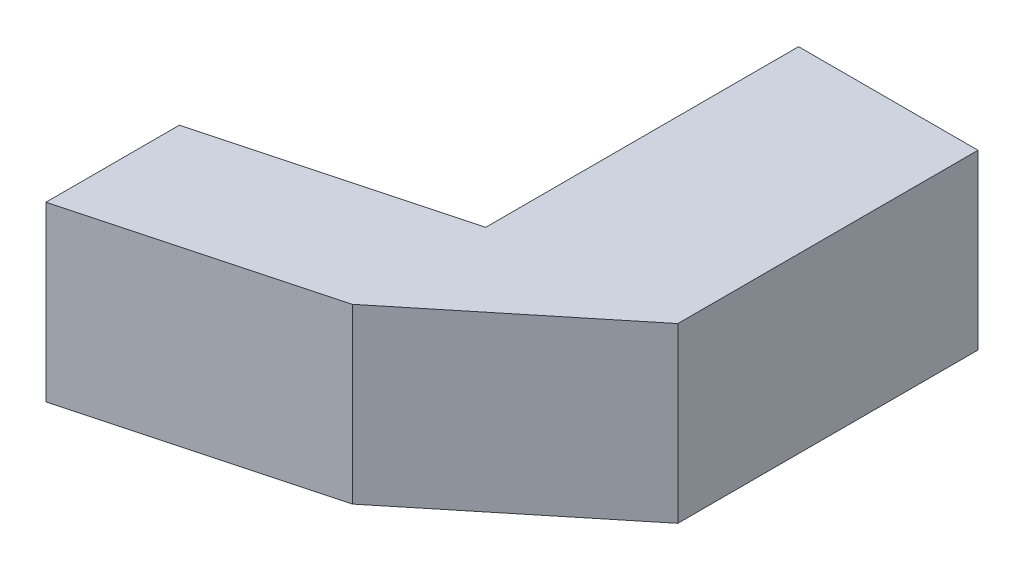
ISO-10303-21;
HEADER;
FILE_DESCRIPTION(('STEP AP214'),'2;1');
FILE_NAME('part.step','',(''),(''),'','','');
FILE_SCHEMA(('AUTOMOTIVE_DESIGN { 1 0 10303 214 1 1 1 1 }'));
ENDSEC;
DATA;
#1=APPLICATION_CONTEXT('core data for automotive mechanical design processes');
#2=APPLICATION_PROTOCOL_DEFINITION('international standard','automotive_design',2000,#1);
#3=PRODUCT_CONTEXT('',#1,'mechanical');
#4=PRODUCT('Part','Part','',(#3));
#5=PRODUCT_RELATED_PRODUCT_CATEGORY('part','',(#4));
#6=PRODUCT_DEFINITION_FORMATION('','',#4);
#7=PRODUCT_DEFINITION_CONTEXT('part definition',#1,'design');
#8=PRODUCT_DEFINITION('design','',#6,#7);
#9=PRODUCT_DEFINITION_SHAPE('','',#8);
#10=(LENGTH_UNIT() NAMED_UNIT(*) SI_UNIT(.MILLI.,.METRE.));
#11=(NAMED_UNIT(*) PLANE_ANGLE_UNIT() SI_UNIT($,.RADIAN.));
#12=(NAMED_UNIT(*) SI_UNIT($,.STERADIAN.) SOLID_ANGLE_UNIT());
#13=UNCERTAINTY_MEASURE_WITH_UNIT(LENGTH_MEASURE(1.E-05),#10,'distance_accuracy_value','');
#14=(GEOMETRIC_REPRESENTATION_CONTEXT(3) GLOBAL_UNCERTAINTY_ASSIGNED_CONTEXT((#13)) GLOBAL_UNIT_ASSIGNED_CONTEXT((#10,
#11,#12)) REPRESENTATION_CONTEXT('',''));
#15=CARTESIAN_POINT('',(0.,0.,0.));
#16=DIRECTION('',(0.,0.,1.));
#17=DIRECTION('',(1.,0.,0.));
#18=AXIS2_PLACEMENT_3D('',#15,#16,#17);
#19=CARTESIAN_POINT('',(-3.379468,-3.1875,18.));
#20=DIRECTION('',(0.,1.,0.));
#21=DIRECTION('',(0.,0.,1.));
#22=AXIS2_PLACEMENT_3D('',#19,#20,#21);
#23=PLANE('',#22);
#24=DIRECTION('',(0.,0.,-1.));
#25=VECTOR('',#24,1.);
#26=CARTESIAN_POINT('',(-3.379468,-3.1875,18.));
#27=LINE('',#26,#25);
#28=CARTESIAN_POINT('',(-3.379468,-3.1875,24.758936));
#29=VERTEX_POINT('',#28);
#30=CARTESIAN_POINT('',(-3.379468,-3.1875,0.));
#31=VERTEX_POINT('',#30);
#32=EDGE_CURVE('E211',#29,#31,#27,.T.);
#33=ORIENTED_EDGE('',*,*,#32,.F.);
#34=DIRECTION('',(0.707106781186546,0.,-0.707106781186549));
#35=VECTOR('',#34,1.);
#36=CARTESIAN_POINT('',(3.379468,-3.1875,18.));
#37=LINE('',#36,#35);
#38=CARTESIAN_POINT('',(3.379468,-3.1875,18.));
#39=VERTEX_POINT('',#38);
#40=EDGE_CURVE('E224',#29,#39,#37,.T.);
#41=ORIENTED_EDGE('',*,*,#40,.T.);
#42=DIRECTION('',(0.,0.,-1.));
#43=VECTOR('',#42,1.);
#44=CARTESIAN_POINT('',(3.379468,-3.1875,18.));
#45=LINE('',#44,#43);
#46=CARTESIAN_POINT('',(3.379468,-3.1875,0.));
#47=VERTEX_POINT('',#46);
#48=EDGE_CURVE('E208',#39,#47,#45,.T.);
#49=ORIENTED_EDGE('',*,*,#48,.T.);
#50=DIRECTION('',(1.,0.,0.));
#51=VECTOR('',#50,1.);
#52=CARTESIAN_POINT('',(-3.379468,-3.1875,0.));
#53=LINE('',#52,#51);
#54=EDGE_CURVE('E217',#31,#47,#53,.T.);
#55=ORIENTED_EDGE('',*,*,#54,.F.);
#56=EDGE_LOOP('',(#33,#41,#49,#55));
#57=FACE_BOUND('',#56,.T.);
#58=ADVANCED_FACE('F85',(#57),#23,.T.);
#59=CARTESIAN_POINT('',(-5.379468,-5.1875,18.));
#60=DIRECTION('',(0.,1.,0.));
#61=DIRECTION('',(0.,0.,1.));
#62=AXIS2_PLACEMENT_3D('',#59,#60,#61);
#63=PLANE('',#62);
#64=DIRECTION('',(0.,0.,-1.));
#65=VECTOR('',#64,1.);
#66=CARTESIAN_POINT('',(5.379468,-5.1875,18.));
#67=LINE('',#66,#65);
#68=CARTESIAN_POINT('',(5.379468,-5.1875,18.));
#69=VERTEX_POINT('',#68);
#70=CARTESIAN_POINT('',(5.379468,-5.1875,0.));
#71=VERTEX_POINT('',#70);
#72=EDGE_CURVE('E12',#69,#71,#67,.T.);
#73=ORIENTED_EDGE('',*,*,#72,.F.);
#74=DIRECTION('',(-0.775503330958341,0.,0.631343475195964));
#75=VECTOR('',#74,1.);
#76=CARTESIAN_POINT('',(-5.379468,-5.1875,26.758936));
#77=LINE('',#76,#75);
#78=CARTESIAN_POINT('',(-5.379468,-5.1875,26.758936));
#79=VERTEX_POINT('',#78);
#80=EDGE_CURVE('E179',#69,#79,#77,.T.);
#81=ORIENTED_EDGE('',*,*,#80,.T.);
#82=DIRECTION('',(-0.965925826289069,0.,0.258819045102518));
#83=VECTOR('',#82,1.);
#84=CARTESIAN_POINT('',(-5.379468,-5.1875,26.758936));
#85=LINE('',#84,#83);
#86=CARTESIAN_POINT('',(-19.868355394336,-5.1875,30.6412216765378));
#87=VERTEX_POINT('',#86);
#88=EDGE_CURVE('E178',#79,#87,#85,.T.);
#89=ORIENTED_EDGE('',*,*,#88,.T.);
#90=DIRECTION('',(0.,0.,-1.));
#91=VECTOR('',#90,1.);
#92=CARTESIAN_POINT('',(-19.868355394336,-5.1875,30.6412216765378));
#93=LINE('',#92,#91);
#94=CARTESIAN_POINT('',(-19.868355394336,-5.1875,22.6412216765378));
#95=VERTEX_POINT('',#94);
#96=EDGE_CURVE('E250',#87,#95,#93,.T.);
#97=ORIENTED_EDGE('',*,*,#96,.T.);
#98=DIRECTION('',(0.965925826289069,0.,-0.258819045102518));
#99=VECTOR('',#98,1.);
#100=CARTESIAN_POINT('',(-19.868355394336,-5.1875,22.6412216765378));
#101=LINE('',#100,#99);
#102=CARTESIAN_POINT('',(-5.379468,-5.1875,18.758936));
#103=VERTEX_POINT('',#102);
#104=EDGE_CURVE('E247',#95,#103,#101,.T.);
#105=ORIENTED_EDGE('',*,*,#104,.T.);
#106=DIRECTION('',(0.,0.,-1.));
#107=VECTOR('',#106,1.);
#108=CARTESIAN_POINT('',(-5.379468,-5.1875,18.));
#109=LINE('',#108,#107);
#110=CARTESIAN_POINT('',(-5.379468,-5.1875,0.));
#111=VERTEX_POINT('',#110);
#112=EDGE_CURVE('E187',#103,#111,#109,.T.);
#113=ORIENTED_EDGE('',*,*,#112,.T.);
#114=DIRECTION('',(1.,0.,0.));
#115=VECTOR('',#114,1.);
#116=CARTESIAN_POINT('',(-5.379468,-5.1875,0.));
#117=LINE('',#116,#115);
#118=EDGE_CURVE('E202',#111,#71,#117,.T.);
#119=ORIENTED_EDGE('',*,*,#118,.T.);
#120=EDGE_LOOP('',(#73,#81,#89,#97,#105,#113,#119));
#121=FACE_BOUND('',#120,.T.);
#122=ADVANCED_FACE('F87',(#121),#63,.F.);
#123=CARTESIAN_POINT('',(5.379468,-5.1875,18.));
#124=DIRECTION('',(-1.,0.,0.));
#125=DIRECTION('',(0.,0.,1.));
#126=AXIS2_PLACEMENT_3D('',#123,#124,#125);
#127=PLANE('',#126);
#128=DIRECTION('',(0.,1.,0.));
#129=VECTOR('',#128,1.);
#130=CARTESIAN_POINT('',(5.379468,-5.1875,0.));
#131=LINE('',#130,#129);
#132=CARTESIAN_POINT('',(5.379468,5.1875,0.));
#133=VERTEX_POINT('',#132);
#134=EDGE_CURVE('E191',#71,#133,#131,.T.);
#135=ORIENTED_EDGE('',*,*,#134,.T.);
#136=DIRECTION('',(0.,0.,-1.));
#137=VECTOR('',#136,1.);
#138=CARTESIAN_POINT('',(5.379468,5.1875,18.));
#139=LINE('',#138,#137);
#140=CARTESIAN_POINT('',(5.379468,5.1875,18.));
#141=VERTEX_POINT('',#140);
#142=EDGE_CURVE('E93',#141,#133,#139,.T.);
#143=ORIENTED_EDGE('',*,*,#142,.F.);
#144=DIRECTION('',(0.,1.,0.));
#145=VECTOR('',#144,1.);
#146=CARTESIAN_POINT('',(5.379468,-5.1875,18.));
#147=LINE('',#146,#145);
#148=EDGE_CURVE('E182',#69,#141,#147,.T.);
#149=ORIENTED_EDGE('',*,*,#148,.F.);
#150=ORIENTED_EDGE('',*,*,#72,.T.);
#151=EDGE_LOOP('',(#135,#143,#149,#150));
#152=FACE_BOUND('',#151,.T.);
#153=ADVANCED_FACE('F190',(#152),#127,.F.);
#154=CARTESIAN_POINT('',(-5.379468,5.1875,18.));
#155=DIRECTION('',(0.,1.,0.));
#156=DIRECTION('',(0.,0.,1.));
#157=AXIS2_PLACEMENT_3D('',#154,#155,#156);
#158=PLANE('',#157);
#159=DIRECTION('',(-0.775503330958341,0.,0.631343475195964));
#160=VECTOR('',#159,1.);
#161=CARTESIAN_POINT('',(-5.379468,5.1875,26.758936));
#162=LINE('',#161,#160);
#163=CARTESIAN_POINT('',(-5.379468,5.1875,26.758936));
#164=VERTEX_POINT('',#163);
#165=EDGE_CURVE('E168',#141,#164,#162,.T.);
#166=ORIENTED_EDGE('',*,*,#165,.F.);
#167=ORIENTED_EDGE('',*,*,#142,.T.);
#168=DIRECTION('',(1.,0.,0.));
#169=VECTOR('',#168,1.);
#170=CARTESIAN_POINT('',(-5.379468,5.1875,0.));
#171=LINE('',#170,#169);
#172=CARTESIAN_POINT('',(-5.379468,5.1875,0.));
#173=VERTEX_POINT('',#172);
#174=EDGE_CURVE('E199',#173,#133,#171,.T.);
#175=ORIENTED_EDGE('',*,*,#174,.F.);
#176=DIRECTION('',(0.,0.,-1.));
#177=VECTOR('',#176,1.);
#178=CARTESIAN_POINT('',(-5.379468,5.1875,18.));
#179=LINE('',#178,#177);
#180=CARTESIAN_POINT('',(-5.379468,5.1875,18.758936));
#181=VERTEX_POINT('',#180);
#182=EDGE_CURVE('E193',#181,#173,#179,.T.);
#183=ORIENTED_EDGE('',*,*,#182,.F.);
#184=DIRECTION('',(0.965925826289069,0.,-0.258819045102518));
#185=VECTOR('',#184,1.);
#186=CARTESIAN_POINT('',(-19.868355394336,5.1875,22.6412216765378));
#187=LINE('',#186,#185);
#188=CARTESIAN_POINT('',(-19.868355394336,5.1875,22.6412216765378));
#189=VERTEX_POINT('',#188);
#190=EDGE_CURVE('E240',#189,#181,#187,.T.);
#191=ORIENTED_EDGE('',*,*,#190,.F.);
#192=DIRECTION('',(0.,0.,-1.));
#193=VECTOR('',#192,1.);
#194=CARTESIAN_POINT('',(-19.868355394336,5.1875,30.6412216765378));
#195=LINE('',#194,#193);
#196=CARTESIAN_POINT('',(-19.868355394336,5.1875,30.6412216765378));
#197=VERTEX_POINT('',#196);
#198=EDGE_CURVE('E237',#197,#189,#195,.T.);
#199=ORIENTED_EDGE('',*,*,#198,.F.);
#200=DIRECTION('',(-0.965925826289069,0.,0.258819045102518));
#201=VECTOR('',#200,1.);
#202=CARTESIAN_POINT('',(-5.379468,5.1875,26.758936));
#203=LINE('',#202,#201);
#204=EDGE_CURVE('E175',#164,#197,#203,.T.);
#205=ORIENTED_EDGE('',*,*,#204,.F.);
#206=EDGE_LOOP('',(#166,#167,#175,#183,#191,#199,#205));
#207=FACE_BOUND('',#206,.T.);
#208=ADVANCED_FACE('F170',(#207),#158,.T.);
#209=CARTESIAN_POINT('',(-5.379468,-5.1875,18.));
#210=DIRECTION('',(-1.,0.,0.));
#211=DIRECTION('',(0.,0.,1.));
#212=AXIS2_PLACEMENT_3D('',#209,#210,#211);
#213=PLANE('',#212);
#214=DIRECTION('',(0.,-1.,0.));
#215=VECTOR('',#214,1.);
#216=CARTESIAN_POINT('',(-5.379468,23.9256047820905,18.758936));
#217=LINE('',#216,#215);
#218=EDGE_CURVE('E100',#181,#103,#217,.T.);
#219=ORIENTED_EDGE('',*,*,#218,.F.);
#220=ORIENTED_EDGE('',*,*,#182,.T.);
#221=DIRECTION('',(0.,1.,0.));
#222=VECTOR('',#221,1.);
#223=CARTESIAN_POINT('',(-5.379468,-5.1875,0.));
#224=LINE('',#223,#222);
#225=EDGE_CURVE('E188',#111,#173,#224,.T.);
#226=ORIENTED_EDGE('',*,*,#225,.F.);
#227=ORIENTED_EDGE('',*,*,#112,.F.);
#228=EDGE_LOOP('',(#219,#220,#226,#227));
#229=FACE_BOUND('',#228,.T.);
#230=ADVANCED_FACE('F268',(#229),#213,.T.);
#231=CARTESIAN_POINT('',(0.,0.,0.));
#232=DIRECTION('',(0.,0.,1.));
#233=DIRECTION('',(1.,0.,0.));
#234=AXIS2_PLACEMENT_3D('',#231,#232,#233);
#235=PLANE('',#234);
#236=DIRECTION('',(0.,1.,0.));
#237=VECTOR('',#236,1.);
#238=CARTESIAN_POINT('',(3.379468,-3.1875,0.));
#239=LINE('',#238,#237);
#240=CARTESIAN_POINT('',(3.379468,3.1875,0.));
#241=VERTEX_POINT('',#240);
#242=EDGE_CURVE('E220',#47,#241,#239,.T.);
#243=ORIENTED_EDGE('',*,*,#242,.T.);
#244=DIRECTION('',(1.,0.,0.));
#245=VECTOR('',#244,1.);
#246=CARTESIAN_POINT('',(-3.379468,3.1875,0.));
#247=LINE('',#246,#245);
#248=CARTESIAN_POINT('',(-3.379468,3.1875,0.));
#249=VERTEX_POINT('',#248);
#250=EDGE_CURVE('E108',#249,#241,#247,.T.);
#251=ORIENTED_EDGE('',*,*,#250,.F.);
#252=DIRECTION('',(0.,1.,0.));
#253=VECTOR('',#252,1.);
#254=CARTESIAN_POINT('',(-3.379468,-3.1875,0.));
#255=LINE('',#254,#253);
#256=EDGE_CURVE('E214',#31,#249,#255,.T.);
#257=ORIENTED_EDGE('',*,*,#256,.F.);
#258=ORIENTED_EDGE('',*,*,#54,.T.);
#259=EDGE_LOOP('',(#243,#251,#257,#258));
#260=FACE_BOUND('',#259,.T.);
#261=ORIENTED_EDGE('',*,*,#118,.F.);
#262=ORIENTED_EDGE('',*,*,#225,.T.);
#263=ORIENTED_EDGE('',*,*,#174,.T.);
#264=ORIENTED_EDGE('',*,*,#134,.F.);
#265=EDGE_LOOP('',(#261,#262,#263,#264));
#266=FACE_BOUND('',#265,.T.);
#267=ADVANCED_FACE('F271',(#260,#266),#235,.F.);
#268=CARTESIAN_POINT('',(-3.379468,3.1875,18.));
#269=DIRECTION('',(0.,1.,0.));
#270=DIRECTION('',(0.,0.,1.));
#271=AXIS2_PLACEMENT_3D('',#268,#269,#270);
#272=PLANE('',#271);
#273=ORIENTED_EDGE('',*,*,#250,.T.);
#274=DIRECTION('',(0.,0.,-1.));
#275=VECTOR('',#274,1.);
#276=CARTESIAN_POINT('',(3.379468,3.1875,18.));
#277=LINE('',#276,#275);
#278=CARTESIAN_POINT('',(3.379468,3.1875,18.));
#279=VERTEX_POINT('',#278);
#280=EDGE_CURVE('E206',#279,#241,#277,.T.);
#281=ORIENTED_EDGE('',*,*,#280,.F.);
#282=DIRECTION('',(0.707106781186546,0.,-0.707106781186549));
#283=VECTOR('',#282,1.);
#284=CARTESIAN_POINT('',(-10.7106936018909,3.1875,32.0901616018909));
#285=LINE('',#284,#283);
#286=CARTESIAN_POINT('',(-3.379468,3.1875,24.758936));
#287=VERTEX_POINT('',#286);
#288=EDGE_CURVE('E231',#287,#279,#285,.T.);
#289=ORIENTED_EDGE('',*,*,#288,.F.);
#290=DIRECTION('',(0.,0.,-1.));
#291=VECTOR('',#290,1.);
#292=CARTESIAN_POINT('',(-3.379468,3.1875,18.));
#293=LINE('',#292,#291);
#294=EDGE_CURVE('E204',#287,#249,#293,.T.);
#295=ORIENTED_EDGE('',*,*,#294,.T.);
#296=EDGE_LOOP('',(#273,#281,#289,#295));
#297=FACE_BOUND('',#296,.T.);
#298=ADVANCED_FACE('F273',(#297),#272,.F.);
#299=CARTESIAN_POINT('',(-3.379468,-3.1875,18.));
#300=DIRECTION('',(-1.,0.,0.));
#301=DIRECTION('',(0.,0.,1.));
#302=AXIS2_PLACEMENT_3D('',#299,#300,#301);
#303=PLANE('',#302);
#304=ORIENTED_EDGE('',*,*,#256,.T.);
#305=ORIENTED_EDGE('',*,*,#294,.F.);
#306=DIRECTION('',(0.,1.,0.));
#307=VECTOR('',#306,1.);
#308=CARTESIAN_POINT('',(-3.379468,-3.1875,24.758936));
#309=LINE('',#308,#307);
#310=EDGE_CURVE('E233',#29,#287,#309,.T.);
#311=ORIENTED_EDGE('',*,*,#310,.F.);
#312=ORIENTED_EDGE('',*,*,#32,.T.);
#313=EDGE_LOOP('',(#304,#305,#311,#312));
#314=FACE_BOUND('',#313,.T.);
#315=ADVANCED_FACE('F280',(#314),#303,.F.);
#316=CARTESIAN_POINT('',(3.379468,-3.1875,18.));
#317=DIRECTION('',(-1.,0.,0.));
#318=DIRECTION('',(0.,0.,1.));
#319=AXIS2_PLACEMENT_3D('',#316,#317,#318);
#320=PLANE('',#319);
#321=ORIENTED_EDGE('',*,*,#242,.F.);
#322=ORIENTED_EDGE('',*,*,#48,.F.);
#323=DIRECTION('',(0.,1.,0.));
#324=VECTOR('',#323,1.);
#325=CARTESIAN_POINT('',(3.379468,-3.1875,18.));
#326=LINE('',#325,#324);
#327=EDGE_CURVE('E209',#39,#279,#326,.T.);
#328=ORIENTED_EDGE('',*,*,#327,.T.);
#329=ORIENTED_EDGE('',*,*,#280,.T.);
#330=EDGE_LOOP('',(#321,#322,#328,#329));
#331=FACE_BOUND('',#330,.T.);
#332=ADVANCED_FACE('F293',(#331),#320,.T.);
#333=CARTESIAN_POINT('',(-5.379468,23.9256047820905,26.758936));
#334=DIRECTION('',(0.258819045102518,0.,0.965925826289069));
#335=DIRECTION('',(0.965925826289069,0.,-0.258819045102518));
#336=AXIS2_PLACEMENT_3D('',#333,#334,#335);
#337=PLANE('',#336);
#338=DIRECTION('',(0.,1.,0.));
#339=VECTOR('',#338,1.);
#340=CARTESIAN_POINT('',(-5.379468,-5.1875,26.758936));
#341=LINE('',#340,#339);
#342=EDGE_CURVE('E229',#79,#164,#341,.T.);
#343=ORIENTED_EDGE('',*,*,#342,.T.);
#344=ORIENTED_EDGE('',*,*,#204,.T.);
#345=DIRECTION('',(0.,-1.,0.));
#346=VECTOR('',#345,1.);
#347=CARTESIAN_POINT('',(-19.868355394336,23.9256047820905,30.6412216765378));
#348=LINE('',#347,#346);
#349=EDGE_CURVE('E235',#197,#87,#348,.T.);
#350=ORIENTED_EDGE('',*,*,#349,.T.);
#351=ORIENTED_EDGE('',*,*,#88,.F.);
#352=EDGE_LOOP('',(#343,#344,#350,#351));
#353=FACE_BOUND('',#352,.T.);
#354=ADVANCED_FACE('F258',(#353),#337,.T.);
#355=CARTESIAN_POINT('',(-19.868355394336,23.9256047820905,30.6412216765378));
#356=DIRECTION('',(-1.,0.,0.));
#357=DIRECTION('',(0.,0.,1.));
#358=AXIS2_PLACEMENT_3D('',#355,#356,#357);
#359=PLANE('',#358);
#360=ORIENTED_EDGE('',*,*,#349,.F.);
#361=ORIENTED_EDGE('',*,*,#198,.T.);
#362=DIRECTION('',(0.,-1.,0.));
#363=VECTOR('',#362,1.);
#364=CARTESIAN_POINT('',(-19.868355394336,23.9256047820905,22.6412216765378));
#365=LINE('',#364,#363);
#366=EDGE_CURVE('E238',#189,#95,#365,.T.);
#367=ORIENTED_EDGE('',*,*,#366,.T.);
#368=ORIENTED_EDGE('',*,*,#96,.F.);
#369=EDGE_LOOP('',(#360,#361,#367,#368));
#370=FACE_BOUND('',#369,.T.);
#371=ADVANCED_FACE('F262',(#370),#359,.T.);
#372=CARTESIAN_POINT('',(-19.868355394336,23.9256047820905,22.6412216765378));
#373=DIRECTION('',(-0.258819045102518,0.,-0.965925826289069));
#374=DIRECTION('',(-0.965925826289069,0.,0.258819045102518));
#375=AXIS2_PLACEMENT_3D('',#372,#373,#374);
#376=PLANE('',#375);
#377=ORIENTED_EDGE('',*,*,#366,.F.);
#378=ORIENTED_EDGE('',*,*,#190,.T.);
#379=ORIENTED_EDGE('',*,*,#218,.T.);
#380=ORIENTED_EDGE('',*,*,#104,.F.);
#381=EDGE_LOOP('',(#377,#378,#379,#380));
#382=FACE_BOUND('',#381,.T.);
#383=ADVANCED_FACE('F266',(#382),#376,.T.);
#384=CARTESIAN_POINT('',(-5.379468,19.0609877988267,26.758936));
#385=DIRECTION('',(0.631343475195964,0.,0.775503330958341));
#386=DIRECTION('',(0.775503330958341,0.,-0.631343475195964));
#387=AXIS2_PLACEMENT_3D('',#384,#385,#386);
#388=PLANE('',#387);
#389=ORIENTED_EDGE('',*,*,#148,.T.);
#390=ORIENTED_EDGE('',*,*,#165,.T.);
#391=ORIENTED_EDGE('',*,*,#342,.F.);
#392=ORIENTED_EDGE('',*,*,#80,.F.);
#393=EDGE_LOOP('',(#389,#390,#391,#392));
#394=FACE_BOUND('',#393,.T.);
#395=ADVANCED_FACE('F183',(#394),#388,.T.);
#396=CARTESIAN_POINT('',(3.379468,19.0609877988267,18.));
#397=DIRECTION('',(-0.707106781186549,0.,-0.707106781186546));
#398=DIRECTION('',(-0.707106781186546,0.,0.707106781186549));
#399=AXIS2_PLACEMENT_3D('',#396,#397,#398);
#400=PLANE('',#399);
#401=ORIENTED_EDGE('',*,*,#327,.F.);
#402=ORIENTED_EDGE('',*,*,#40,.F.);
#403=ORIENTED_EDGE('',*,*,#310,.T.);
#404=ORIENTED_EDGE('',*,*,#288,.T.);
#405=EDGE_LOOP('',(#401,#402,#403,#404));
#406=FACE_BOUND('',#405,.T.);
#407=ADVANCED_FACE('F307',(#406),#400,.T.);
#408=CLOSED_SHELL('',(#58,#122,#153,#208,#230,#267,#298,#315,#332,#354,#371,#383,#395,#407));
#409=MANIFOLD_SOLID_BREP('B2',#408);
#410=ADVANCED_BREP_SHAPE_REPRESENTATION('',(#18,#409),#14);
#411=SHAPE_DEFINITION_REPRESENTATION(#9,#410);
ENDSEC;
END-ISO-10303-21;
